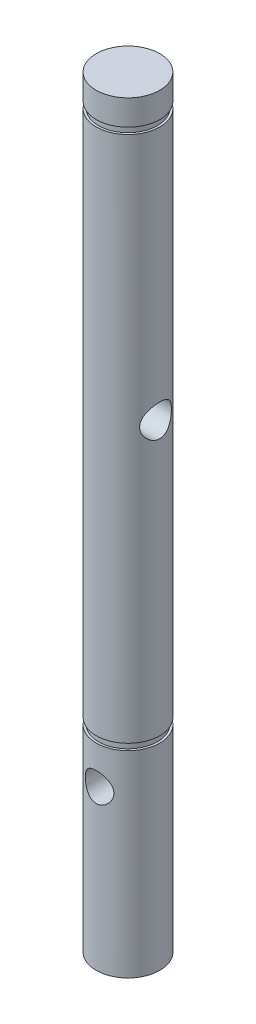
ISO-10303-21;
HEADER;
FILE_DESCRIPTION(('STEP AP214'),'2;1');
FILE_NAME('part.step','',(''),(''),'','','');
FILE_SCHEMA(('AUTOMOTIVE_DESIGN { 1 0 10303 214 1 1 1 1 }'));
ENDSEC;
DATA;
#1=APPLICATION_CONTEXT('core data for automotive mechanical design processes');
#2=APPLICATION_PROTOCOL_DEFINITION('international standard','automotive_design',2000,#1);
#3=PRODUCT_CONTEXT('',#1,'mechanical');
#4=PRODUCT('Part','Part','',(#3));
#5=PRODUCT_RELATED_PRODUCT_CATEGORY('part','',(#4));
#6=PRODUCT_DEFINITION_FORMATION('','',#4);
#7=PRODUCT_DEFINITION_CONTEXT('part definition',#1,'design');
#8=PRODUCT_DEFINITION('design','',#6,#7);
#9=PRODUCT_DEFINITION_SHAPE('','',#8);
#10=(LENGTH_UNIT() NAMED_UNIT(*) SI_UNIT(.MILLI.,.METRE.));
#11=(NAMED_UNIT(*) PLANE_ANGLE_UNIT() SI_UNIT($,.RADIAN.));
#12=(NAMED_UNIT(*) SI_UNIT($,.STERADIAN.) SOLID_ANGLE_UNIT());
#13=UNCERTAINTY_MEASURE_WITH_UNIT(LENGTH_MEASURE(1.E-05),#10,'distance_accuracy_value','');
#14=(GEOMETRIC_REPRESENTATION_CONTEXT(3) GLOBAL_UNCERTAINTY_ASSIGNED_CONTEXT((#13)) GLOBAL_UNIT_ASSIGNED_CONTEXT((#10,
#11,#12)) REPRESENTATION_CONTEXT('',''));
#15=CARTESIAN_POINT('',(0.,0.,0.));
#16=DIRECTION('',(0.,0.,1.));
#17=DIRECTION('',(1.,0.,0.));
#18=AXIS2_PLACEMENT_3D('',#15,#16,#17);
#19=CARTESIAN_POINT('',(0.,60.,0.));
#20=DIRECTION('',(0.,-1.,0.));
#21=DIRECTION('',(0.,0.,-0.999999999999999));
#22=AXIS2_PLACEMENT_3D('',#19,#20,#21);
#23=CYLINDRICAL_SURFACE('',#22,5.);
#24=CARTESIAN_POINT('',(-5.00000000000006,12.5,0.));
#25=CARTESIAN_POINT('',(-4.99999177550481,12.500009669056,-0.13142668233428));
#26=CARTESIAN_POINT('',(-4.99476199135279,12.510425561774,-0.263015634437191));
#27=CARTESIAN_POINT('',(-4.97435418561017,12.551631821162,-0.522301454622866));
#28=CARTESIAN_POINT('',(-4.95915727187672,12.582460880925,-0.64999044856409));
#29=CARTESIAN_POINT('',(-4.92040690922479,12.6629846227188,-0.897333631316197));
#30=CARTESIAN_POINT('',(-4.89688595907258,12.7126059877827,-1.01701694536277));
#31=CARTESIAN_POINT('',(-4.84364443325825,12.8289265262518,-1.24618160399671));
#32=CARTESIAN_POINT('',(-4.81392434644419,12.8956243531451,-1.35566375203769));
#33=CARTESIAN_POINT('',(-4.7489064505063,13.0487931316426,-1.56876952630997));
#34=CARTESIAN_POINT('',(-4.71337997659087,13.1362162002298,-1.67163802294308));
#35=CARTESIAN_POINT('',(-4.6414992577673,13.3263036959853,-1.86194861703333));
#36=CARTESIAN_POINT('',(-4.60514440566902,13.4289796288401,-1.94937895911556));
#37=CARTESIAN_POINT('',(-4.53247377945627,13.6562083744453,-2.11312999967248));
#38=CARTESIAN_POINT('',(-4.49637967412566,13.781840246035,-2.18806333849064));
#39=CARTESIAN_POINT('',(-4.43214946943551,14.0459183397954,-2.31542056761488));
#40=CARTESIAN_POINT('',(-4.40400769020791,14.1843553217626,-2.36786053751678));
#41=CARTESIAN_POINT('',(-4.36144667591401,14.4616627635964,-2.44533110537648));
#42=CARTESIAN_POINT('',(-4.3463067895845,14.6000111301796,-2.47181464267575));
#43=CARTESIAN_POINT('',(-4.32954724872148,14.8799470944376,-2.5010674832974));
#44=CARTESIAN_POINT('',(-4.32791423358429,15.0215313521751,-2.50386022093907));
#45=CARTESIAN_POINT('',(-4.33777325642936,15.2857150607909,-2.48671821792512));
#46=CARTESIAN_POINT('',(-4.34771909154982,15.4085600780583,-2.46946139884052));
#47=CARTESIAN_POINT('',(-4.37690571834674,15.6493047734319,-2.4173496226438));
#48=CARTESIAN_POINT('',(-4.39614947079455,15.7672028632631,-2.38248905974452));
#49=CARTESIAN_POINT('',(-4.44218691031841,15.9980728314143,-2.29552445096457));
#50=CARTESIAN_POINT('',(-4.46914601659994,16.1108659969645,-2.24303766778984));
#51=CARTESIAN_POINT('',(-4.52758510703508,16.3265857314749,-2.12260421917008));
#52=CARTESIAN_POINT('',(-4.55906711950469,16.4295078390002,-2.05465060953117));
#53=CARTESIAN_POINT('',(-4.62782894758205,16.6363031318581,-1.8951651372819));
#54=CARTESIAN_POINT('',(-4.66533775591861,16.7386421839404,-1.80173614592315));
#55=CARTESIAN_POINT('',(-4.7386905825102,16.9268385464772,-1.5988889468534));
#56=CARTESIAN_POINT('',(-4.77453379897004,17.0126879800847,-1.48946314143568));
#57=CARTESIAN_POINT('',(-4.84254968207409,17.1692141525743,-1.25129126457959));
#58=CARTESIAN_POINT('',(-4.87447460405015,17.2390011811143,-1.12188397899849));
#59=CARTESIAN_POINT('',(-4.92894702803107,17.3552425726075,-0.851165538721943));
#60=CARTESIAN_POINT('',(-4.95150197358891,17.4017154625379,-0.709863940663126));
#61=CARTESIAN_POINT('',(-4.98310834353577,17.4661885092917,-0.431916229151755));
#62=CARTESIAN_POINT('',(-4.9931234575324,17.4862280893669,-0.295853826370885));
#63=CARTESIAN_POINT('',(-5.00182533647793,17.5036618278361,-0.0219489998732789));
#64=CARTESIAN_POINT('',(-5.00051746803424,17.5010667140985,0.115892549675112));
#65=CARTESIAN_POINT('',(-4.98727980633467,17.4744832789533,0.378082429964652));
#66=CARTESIAN_POINT('',(-4.97618114219993,17.4521686681756,0.5026485201237));
#67=CARTESIAN_POINT('',(-4.9455542828753,17.3894048202616,0.746017230755967));
#68=CARTESIAN_POINT('',(-4.92602515837623,17.3489535838641,0.86481921423188));
#69=CARTESIAN_POINT('',(-4.87960628532327,17.2500038339196,1.09722152111965));
#70=CARTESIAN_POINT('',(-4.85252204417874,17.1910223747177,1.21057599249832));
#71=CARTESIAN_POINT('',(-4.79359935799751,17.0572311608751,1.4261534042644));
#72=CARTESIAN_POINT('',(-4.76175888940532,16.9824146634801,1.52837157450204));
#73=CARTESIAN_POINT('',(-4.69270553315083,16.8105989367091,1.72941922315489));
#74=CARTESIAN_POINT('',(-4.65527212009487,16.7121428290247,1.826930194285));
#75=CARTESIAN_POINT('',(-4.58155978921588,16.5001871219505,2.00464080257225));
#76=CARTESIAN_POINT('',(-4.54528168472407,16.38667720293,2.08482846428689));
#77=CARTESIAN_POINT('',(-4.47627980545279,16.1408908645153,2.22926978618998));
#78=CARTESIAN_POINT('',(-4.44381323981255,16.0079718347088,2.29256373922248));
#79=CARTESIAN_POINT('',(-4.38935180726746,15.7312248311174,2.39520706511462));
#80=CARTESIAN_POINT('',(-4.36734345549013,15.5874111839999,2.43458729077057));
#81=CARTESIAN_POINT('',(-4.33903752569351,15.307724442637,2.48465421767006));
#82=CARTESIAN_POINT('',(-4.33143458674097,15.172414365881,2.49773248744362));
#83=CARTESIAN_POINT('',(-4.32913386592581,14.9013823326192,2.50172288950903));
#84=CARTESIAN_POINT('',(-4.33443049025113,14.7656605801263,2.49264462983273));
#85=CARTESIAN_POINT('',(-4.35594655164666,14.5112912443831,2.45481530197338));
#86=CARTESIAN_POINT('',(-4.37107736338136,14.3922488182792,2.42802074302699));
#87=CARTESIAN_POINT('',(-4.40927540337603,14.1604797078,2.35793843840545));
#88=CARTESIAN_POINT('',(-4.43234518434963,14.0477550684334,2.31464538728735));
#89=CARTESIAN_POINT('',(-4.48571326433411,13.8234378472802,2.20953919315542));
#90=CARTESIAN_POINT('',(-4.51639307998451,13.7124301482649,2.14667719009406));
#91=CARTESIAN_POINT('',(-4.58088327077456,13.5018137567599,2.00537808387992));
#92=CARTESIAN_POINT('',(-4.61469526970765,13.4022110373712,1.92693287765891));
#93=CARTESIAN_POINT('',(-4.68655816327008,13.2046446362503,1.74550556946069));
#94=CARTESIAN_POINT('',(-4.7246249151498,13.1083506358286,1.64070022469214));
#95=CARTESIAN_POINT('',(-4.79694347383546,12.9343441505719,1.41539785420688));
#96=CARTESIAN_POINT('',(-4.83119321905444,12.8566416813941,1.29489242426335));
#97=CARTESIAN_POINT('',(-4.8924514945778,12.7219030205159,1.03978808878538));
#98=CARTESIAN_POINT('',(-4.91940711437488,12.6650168322155,0.905095560782314));
#99=CARTESIAN_POINT('',(-4.95177960923351,12.5978161412076,0.696328709257376));
#100=CARTESIAN_POINT('',(-4.96122314081874,12.5784446019981,0.625670413494109));
#101=CARTESIAN_POINT('',(-4.97717127275101,12.5459340516294,0.482623997839271));
#102=CARTESIAN_POINT('',(-4.9836776682316,12.5327912333236,0.41023696309241));
#103=CARTESIAN_POINT('',(-4.9923820076613,12.5152625277153,0.281518684621679));
#104=CARTESIAN_POINT('',(-4.99523288466453,12.5095450634686,0.225408499555456));
#105=CARTESIAN_POINT('',(-4.99904367329659,12.5019116705342,0.112875528456308));
#106=CARTESIAN_POINT('',(-5.00000353273202,12.4999958467745,0.0564527338382416));
#107=CARTESIAN_POINT('',(-5.00000000000006,12.5,0.));
#108=B_SPLINE_CURVE_WITH_KNOTS('',3,(#24,#25,#26,#27,#28,#29,#30,#31,#32,#33,#34,#35,#36,#37,
#38,#39,#40,#41,#42,#43,#44,#45,#46,#47,#48,#49,#50,#51,#52,#53,#54,#55,#56,#57,#58,#59,#60,#61,
#62,#63,#64,#65,#66,#67,#68,#69,#70,#71,#72,#73,#74,#75,#76,#77,#78,#79,#80,#81,#82,#83,#84,#85,
#86,#87,#88,#89,#90,#91,#92,#93,#94,#95,#96,#97,#98,#99,#100,#101,#102,#103,#104,#105,#106,
#107),.UNSPECIFIED.,.T.,.F.,(4,2,2,2,2,2,2,2,2,2,2,2,2,2,2,2,2,2,2,2,2,2,2,2,2,2,2,2,2,2,2,2,2,
2,2,2,2,2,2,2,2,4),(0.,0.394060643550742,0.788870374273022,1.18215538873078,1.57540940145396,
1.99245439679526,2.40981559413512,2.85954316076885,3.30894869745706,3.73145030350578,
4.15353393322554,4.52514281023304,4.89687009814198,5.27725600421219,5.65781303150554,
6.08662353334698,6.5156383649672,6.96457555536104,7.413155422807,7.82458226178364,
8.23581411278687,8.61517266265303,8.99457304077327,9.38482140069746,9.77523626870849,
10.2039902661037,10.6330397153795,11.0828670540369,11.53211279863,11.9382326875699,
12.3441764966107,12.7114482562151,13.0788382197025,13.4709114195009,13.8631890285845,
14.303131068923,14.7433095845248,15.1866003415819,15.407934939208,15.6291340766844,
15.7983933645035,15.9676573239323),.UNSPECIFIED.);
#109=CARTESIAN_POINT('',(-5.00000000000006,12.5,0.));
#110=VERTEX_POINT('',#109);
#111=EDGE_CURVE('E12',#110,#110,#108,.T.);
#112=ORIENTED_EDGE('',*,*,#111,.T.);
#113=EDGE_LOOP('',(#112));
#114=FACE_BOUND('',#113,.T.);
#115=CARTESIAN_POINT('',(4.33012701892221,15.,-2.49999999999992));
#116=CARTESIAN_POINT('',(4.33013982272995,14.8697334931235,-2.4999894843642));
#117=CARTESIAN_POINT('',(4.33609541965583,14.7392972793237,-2.48974954513162));
#118=CARTESIAN_POINT('',(4.35905877051905,14.4824310284707,-2.44930840724943));
#119=CARTESIAN_POINT('',(4.37608974726021,14.3560099959427,-2.41906526369544));
#120=CARTESIAN_POINT('',(4.41873376871657,14.1113710544389,-2.34024976997567));
#121=CARTESIAN_POINT('',(4.44430111338919,13.9931134264377,-2.29177485369959));
#122=CARTESIAN_POINT('',(4.50106659111457,13.7664394369054,-2.1781688405641));
#123=CARTESIAN_POINT('',(4.53226502875888,13.6580236082041,-2.11303684262669));
#124=CARTESIAN_POINT('',(4.59992173524857,13.444235696083,-1.9616663431725));
#125=CARTESIAN_POINT('',(4.63660159331581,13.3398521655102,-1.87413008816911));
#126=CARTESIAN_POINT('',(4.70929956727452,13.1464790242867,-1.68313452122743));
#127=CARTESIAN_POINT('',(4.74531734512765,13.0574970922449,-1.57966731506045));
#128=CARTESIAN_POINT('',(4.81553692452133,12.8915821235143,-1.35122390789075));
#129=CARTESIAN_POINT('',(4.84945266064072,12.8158655807208,-1.22526797235887));
#130=CARTESIAN_POINT('',(4.90876890230194,12.6871478665161,-0.960392566671062));
#131=CARTESIAN_POINT('',(4.93417477954534,12.6341323595614,-0.821481345389905));
#132=CARTESIAN_POINT('',(4.97201153115068,12.5562383468359,-0.545112359773455));
#133=CARTESIAN_POINT('',(4.98523700553424,12.5296261841348,-0.408254476210918));
#134=CARTESIAN_POINT('',(5.00018959613975,12.4995847032887,-0.131426571755628));
#135=CARTESIAN_POINT('',(5.00192366961172,12.4961413580046,0.00854151460654318));
#136=CARTESIAN_POINT('',(4.9940745479141,12.5118666849314,0.274581311061988));
#137=CARTESIAN_POINT('',(4.98546239730479,12.5290950388045,0.400802997942698));
#138=CARTESIAN_POINT('',(4.95935613149292,12.5822021097601,0.64828442979513));
#139=CARTESIAN_POINT('',(4.9418613516596,12.6180822224401,0.769543802734638));
#140=CARTESIAN_POINT('',(4.89928958219153,12.7077064152249,1.00577347892409));
#141=CARTESIAN_POINT('',(4.87411103823004,12.7616907829302,1.12063355878803));
#142=CARTESIAN_POINT('',(4.81844114966713,12.8856585405036,1.3399420037833));
#143=CARTESIAN_POINT('',(4.78794790393706,12.9556476582558,1.44438662209661));
#144=CARTESIAN_POINT('',(4.72110985998071,13.1172383788325,1.65043415224551));
#145=CARTESIAN_POINT('',(4.68448439995439,13.210257570815,1.75083518757343));
#146=CARTESIAN_POINT('',(4.61135851467031,13.4114743123254,1.93526092574447));
#147=CARTESIAN_POINT('',(4.57485820664071,13.5196834306851,2.01927302893558));
#148=CARTESIAN_POINT('',(4.5036039023121,13.7566204810602,2.17376333660552));
#149=CARTESIAN_POINT('',(4.46910799976771,13.8862150576355,2.24304328744513));
#150=CARTESIAN_POINT('',(4.40938625696441,14.1573441783974,2.35829778250312));
#151=CARTESIAN_POINT('',(4.38415075115166,14.2988660825438,2.4042966455273));
#152=CARTESIAN_POINT('',(4.34861589542584,14.5780362782069,2.46795052756267));
#153=CARTESIAN_POINT('',(4.33729139621243,14.7151027976088,2.48756280529997));
#154=CARTESIAN_POINT('',(4.32794798404026,14.9910033537913,2.50379236652859));
#155=CARTESIAN_POINT('',(4.32991967223277,15.1298360727994,2.50042589328761));
#156=CARTESIAN_POINT('',(4.3458584135146,15.3891347964467,2.47259010835997));
#157=CARTESIAN_POINT('',(4.35848968766636,15.5099486277696,2.4504695417812));
#158=CARTESIAN_POINT('',(4.39235053878354,15.7459194656774,2.38924071158115));
#159=CARTESIAN_POINT('',(4.41358290012584,15.8610746268668,2.35012694655912));
#160=CARTESIAN_POINT('',(4.4634055519914,16.0885283272563,2.25411897151221));
#161=CARTESIAN_POINT('',(4.49229108107658,16.2004475421325,2.19648515923166));
#162=CARTESIAN_POINT('',(4.55390298743127,16.4136731788488,2.06571766003972));
#163=CARTESIAN_POINT('',(4.58663133387873,16.5149741087881,1.99257601083125));
#164=CARTESIAN_POINT('',(4.65719996140835,16.7174469188033,1.82209291799637));
#165=CARTESIAN_POINT('',(4.69516457885708,16.8169928767722,1.72286318078437));
#166=CARTESIAN_POINT('',(4.76835587444748,16.9985305950059,1.50851123849885));
#167=CARTESIAN_POINT('',(4.80358162519331,17.0805164256585,1.39338368664995));
#168=CARTESIAN_POINT('',(4.86853404227335,17.2264343147908,1.14633840638515));
#169=CARTESIAN_POINT('',(4.89809104179854,17.2898327952084,1.01405774389068));
#170=CARTESIAN_POINT('',(4.94708387398472,17.392844759962,0.738805911647383));
#171=CARTESIAN_POINT('',(4.9665285919175,17.432479129605,0.595844253647114));
#172=CARTESIAN_POINT('',(4.99168770453971,17.4834214093564,0.317449205674753));
#173=CARTESIAN_POINT('',(4.99849819767838,17.4969946858303,0.182528609085428));
#174=CARTESIAN_POINT('',(5.00105325940468,17.5021081674945,-0.0878149643373655));
#175=CARTESIAN_POINT('',(4.99680170177046,17.493656085661,-0.223237748726942));
#176=CARTESIAN_POINT('',(4.97834922085641,17.4564589696044,-0.481344982671009));
#177=CARTESIAN_POINT('',(4.96482236636807,17.4290878283636,-0.604280801321727));
#178=CARTESIAN_POINT('',(4.92980234191731,17.3566825502416,-0.843614873664426));
#179=CARTESIAN_POINT('',(4.90830802955521,17.3116458803663,-0.960012187087182));
#180=CARTESIAN_POINT('',(4.85814826741492,17.2031821812606,-1.18855854199591));
#181=CARTESIAN_POINT('',(4.82921542506804,17.1390509753101,-1.30031295715362));
#182=CARTESIAN_POINT('',(4.76720333344982,16.9951058898524,-1.51193650408536));
#183=CARTESIAN_POINT('',(4.73412218229098,16.9152848073731,-1.61180014305398));
#184=CARTESIAN_POINT('',(4.66321523550919,16.7330042055506,-1.80728542324369));
#185=CARTESIAN_POINT('',(4.62524489658364,16.6290822739992,-1.90149582349001));
#186=CARTESIAN_POINT('',(4.55157698284942,16.4063847146177,-2.071656604925));
#187=CARTESIAN_POINT('',(4.51588143910585,16.2875960858007,-2.14759083151535));
#188=CARTESIAN_POINT('',(4.44998982823926,16.0333638823357,-2.28108393396024));
#189=CARTESIAN_POINT('',(4.42000320346983,15.8975126115754,-2.33798627977445));
#190=CARTESIAN_POINT('',(4.38370272660092,15.6867773504802,-2.40494911880456));
#191=CARTESIAN_POINT('',(4.37305486646054,15.6154402243024,-2.42419582683988));
#192=CARTESIAN_POINT('',(4.35507574170933,15.4709593031506,-2.45635087255785));
#193=CARTESIAN_POINT('',(4.34774215854231,15.3978168090455,-2.4692636417917));
#194=CARTESIAN_POINT('',(4.33823779542918,15.270499013453,-2.48591166201418));
#195=CARTESIAN_POINT('',(4.33520487024789,15.2165836784878,-2.491188649792));
#196=CARTESIAN_POINT('',(4.33114674911323,15.1084553836896,-2.4982351254393));
#197=CARTESIAN_POINT('',(4.33012168747262,15.0542424041894,-2.50000437866468));
#198=CARTESIAN_POINT('',(4.33012701892221,15.,-2.49999999999992));
#199=B_SPLINE_CURVE_WITH_KNOTS('',3,(#115,#116,#117,#118,#119,#120,#121,#122,#123,#124,#125,
#126,#127,#128,#129,#130,#131,#132,#133,#134,#135,#136,#137,#138,#139,#140,#141,#142,#143,#144,
#145,#146,#147,#148,#149,#150,#151,#152,#153,#154,#155,#156,#157,#158,#159,#160,#161,#162,#163,
#164,#165,#166,#167,#168,#169,#170,#171,#172,#173,#174,#175,#176,#177,#178,#179,#180,#181,#182,
#183,#184,#185,#186,#187,#188,#189,#190,#191,#192,#193,#194,#195,#196,#197,#198),.UNSPECIFIED.,
.T.,.F.,(4,2,2,2,2,2,2,2,2,2,2,2,2,2,2,2,2,2,2,2,2,2,2,2,2,2,2,2,2,2,2,2,2,2,2,2,2,2,2,2,2,4),
(0.,0.39058030648679,0.781982232061999,1.17132148982694,1.56068181366377,1.98215578129649,
2.40383927716018,2.85394730601998,3.30377067414817,3.72158712424925,4.13915059220184,
4.5204024371643,4.90168281298723,5.28823836832952,5.67493248380763,6.09817978647309,
6.52175120619879,6.97222104328703,7.42221935534343,7.83655727140608,8.2506023297601,
8.61935458565144,8.98822631095241,9.37418241020305,9.76033715555206,10.1951685895662,
10.6301466245059,11.076604535375,11.5226694952701,11.927806759788,12.3328021699001,
12.7111106218381,13.0894733378512,13.4840187680377,13.8787457525689,14.3127560463025,
14.7471485711797,15.195268726016,15.4189244153949,15.6424233996907,15.8050484542806,
15.9676843870379),.UNSPECIFIED.);
#200=CARTESIAN_POINT('',(4.33012701892221,15.,-2.49999999999992));
#201=VERTEX_POINT('',#200);
#202=EDGE_CURVE('E58',#201,#201,#199,.T.);
#203=ORIENTED_EDGE('',*,*,#202,.T.);
#204=EDGE_LOOP('',(#203));
#205=FACE_BOUND('',#204,.T.);
#206=CARTESIAN_POINT('',(0.,-28.,0.));
#207=DIRECTION('',(0.,-1.,0.));
#208=DIRECTION('',(0.,0.,-0.999999999999999));
#209=AXIS2_PLACEMENT_3D('',#206,#207,#208);
#210=CIRCLE('',#209,5.);
#211=CARTESIAN_POINT('',(0.,-28.,-4.99999999999994));
#212=VERTEX_POINT('',#211);
#213=EDGE_CURVE('E126',#212,#212,#210,.T.);
#214=ORIENTED_EDGE('',*,*,#213,.F.);
#215=EDGE_LOOP('',(#214));
#216=FACE_BOUND('',#215,.T.);
#217=CARTESIAN_POINT('',(0.,55.,0.));
#218=DIRECTION('',(0.,1.,0.));
#219=DIRECTION('',(0.,0.,0.999999999999999));
#220=AXIS2_PLACEMENT_3D('',#217,#218,#219);
#221=CIRCLE('',#220,5.);
#222=CARTESIAN_POINT('',(0.,55.,5.00000000000005));
#223=VERTEX_POINT('',#222);
#224=EDGE_CURVE('E138',#223,#223,#221,.T.);
#225=ORIENTED_EDGE('',*,*,#224,.F.);
#226=EDGE_LOOP('',(#225));
#227=FACE_BOUND('',#226,.T.);
#228=ADVANCED_FACE('F46',(#114,#205,#216,#227),#23,.T.);
#229=CARTESIAN_POINT('',(0.,-29.,0.));
#230=DIRECTION('',(0.,-1.,0.));
#231=DIRECTION('',(0.,0.,-0.999999999999999));
#232=AXIS2_PLACEMENT_3D('',#229,#230,#231);
#233=CIRCLE('',#232,5.);
#234=CARTESIAN_POINT('',(0.,-29.,-4.99999999999994));
#235=VERTEX_POINT('',#234);
#236=EDGE_CURVE('E123',#235,#235,#233,.T.);
#237=ORIENTED_EDGE('',*,*,#236,.T.);
#238=EDGE_LOOP('',(#237));
#239=FACE_BOUND('',#238,.T.);
#240=CARTESIAN_POINT('',(0.,-32.7500000000001,-4.99999999999995));
#241=CARTESIAN_POINT('',(-0.11965716387211,-32.7500058491676,-4.99999518032906));
#242=CARTESIAN_POINT('',(-0.239497209577457,-32.759601445644,-4.99565681806755));
#243=CARTESIAN_POINT('',(-0.47572081670774,-32.7975995029155,-4.9787335625156));
#244=CARTESIAN_POINT('',(-0.592095550925141,-32.8260463058645,-4.96612922657749));
#245=CARTESIAN_POINT('',(-0.817598389702702,-32.900458262527,-4.93401032574622));
#246=CARTESIAN_POINT('',(-0.926750955125919,-32.9463603098896,-4.91452067131287));
#247=CARTESIAN_POINT('',(-1.13568251878514,-33.0540936958491,-4.87048664392253));
#248=CARTESIAN_POINT('',(-1.23546350613323,-33.1159216437089,-4.84594334714471));
#249=CARTESIAN_POINT('',(-1.42864166958961,-33.2574297497628,-4.79265454885507));
#250=CARTESIAN_POINT('',(-1.52144083505236,-33.3378684744534,-4.76375726911881));
#251=CARTESIAN_POINT('',(-1.69276142751267,-33.5127023979595,-4.70560933245041));
#252=CARTESIAN_POINT('',(-1.77127412914541,-33.6071060623944,-4.67635847112176));
#253=CARTESIAN_POINT('',(-1.91644184676255,-33.8139787945946,-4.61884309478032));
#254=CARTESIAN_POINT('',(-1.98211224629653,-33.9271889049173,-4.5907410607813));
#255=CARTESIAN_POINT('',(-2.09321326547299,-34.1644814582807,-4.54116574662781));
#256=CARTESIAN_POINT('',(-2.1386559792934,-34.2885573513889,-4.51968850785879));
#257=CARTESIAN_POINT('',(-2.2054422070107,-34.5371932181381,-4.48746493874355));
#258=CARTESIAN_POINT('',(-2.22794402601262,-34.6613728247451,-4.47620638732552));
#259=CARTESIAN_POINT('',(-2.25180742161624,-34.9122154005629,-4.4642537205082));
#260=CARTESIAN_POINT('',(-2.25318367120295,-35.0388765849387,-4.46355227256898));
#261=CARTESIAN_POINT('',(-2.23561914182214,-35.2785819418095,-4.47236713385346));
#262=CARTESIAN_POINT('',(-2.21854075752921,-35.3918044567285,-4.48094689435855));
#263=CARTESIAN_POINT('',(-2.16771485945774,-35.6135619764439,-4.50575226017843));
#264=CARTESIAN_POINT('',(-2.13396347414751,-35.7220958861609,-4.52197964125837));
#265=CARTESIAN_POINT('',(-2.05008139659866,-35.934338665384,-4.56062840437278));
#266=CARTESIAN_POINT('',(-1.99959732959399,-36.0378827649966,-4.58318164475392));
#267=CARTESIAN_POINT('',(-1.88393825005056,-36.2354740947609,-4.63192287969261));
#268=CARTESIAN_POINT('',(-1.8187569861469,-36.3295172590265,-4.65811241910159));
#269=CARTESIAN_POINT('',(-1.66791131474518,-36.5153506742745,-4.71435794303024));
#270=CARTESIAN_POINT('',(-1.58084940988694,-36.605972381396,-4.74453849261974));
#271=CARTESIAN_POINT('',(-1.39252160551632,-36.7717583371506,-4.80318714257215));
#272=CARTESIAN_POINT('',(-1.29125121399167,-36.846917678752,-4.83165469728903));
#273=CARTESIAN_POINT('',(-1.07332333935312,-36.9817637753532,-4.88476427737965));
#274=CARTESIAN_POINT('',(-0.956286364396289,-37.0408990655796,-4.90926046885459));
#275=CARTESIAN_POINT('',(-0.712539817711637,-37.1382179714549,-4.95050723789678));
#276=CARTESIAN_POINT('',(-0.585836558945014,-37.1764151304037,-4.96726282117478));
#277=CARTESIAN_POINT('',(-0.336050927795551,-37.2281520066184,-4.99015693100552));
#278=CARTESIAN_POINT('',(-0.213354125401076,-37.2432551103228,-4.99696705652225));
#279=CARTESIAN_POINT('',(0.0330028549595938,-37.2531293737671,-5.00140648285724));
#280=CARTESIAN_POINT('',(0.156662679358139,-37.2479076740922,-4.99903900798527));
#281=CARTESIAN_POINT('',(0.393606397102664,-37.2183274717246,-4.98581223187082));
#282=CARTESIAN_POINT('',(0.507068143127022,-37.1951338783838,-4.97547003197279));
#283=CARTESIAN_POINT('',(0.728326171242942,-37.1319668703197,-4.94792660884618));
#284=CARTESIAN_POINT('',(0.836121769198267,-37.091991434553,-4.93072455949594));
#285=CARTESIAN_POINT('',(1.04680328444828,-36.9951354538398,-4.89040595603712));
#286=CARTESIAN_POINT('',(1.14943204917316,-36.9377675757586,-4.86712201520418));
#287=CARTESIAN_POINT('',(1.34397554623914,-36.8082861577866,-4.81703610915166));
#288=CARTESIAN_POINT('',(1.43588556437496,-36.7361661678935,-4.79023260693114));
#289=CARTESIAN_POINT('',(1.61437331335907,-36.572309666659,-4.733210880664));
#290=CARTESIAN_POINT('',(1.69988735602748,-36.4794463329559,-4.70289328565371));
#291=CARTESIAN_POINT('',(1.85448776672916,-36.2803394360987,-4.6441071699206));
#292=CARTESIAN_POINT('',(1.92356783385006,-36.1740907647074,-4.61563936145101));
#293=CARTESIAN_POINT('',(2.04486877235093,-35.9475880061162,-4.56322301354684));
#294=CARTESIAN_POINT('',(2.0966129511578,-35.8270450849665,-4.53940877273741));
#295=CARTESIAN_POINT('',(2.17856642952349,-35.5775336202713,-4.50065987671184));
#296=CARTESIAN_POINT('',(2.20879749107805,-35.4485737356845,-4.48571625080522));
#297=CARTESIAN_POINT('',(2.24454528993169,-35.197852587887,-4.46792778615272));
#298=CARTESIAN_POINT('',(2.25196758692373,-35.0764288896237,-4.46415115998425));
#299=CARTESIAN_POINT('',(2.24714266058782,-34.8340893513423,-4.46658268326976));
#300=CARTESIAN_POINT('',(2.23489992569109,-34.7131734017487,-4.47278855427623));
#301=CARTESIAN_POINT('',(2.19277345398226,-34.4832321778432,-4.4935771634473));
#302=CARTESIAN_POINT('',(2.1640532846186,-34.3739383369966,-4.50760581250423));
#303=CARTESIAN_POINT('',(2.09103437001123,-34.1617430309526,-4.54193721731509));
#304=CARTESIAN_POINT('',(2.04673109152546,-34.0588434361493,-4.56224179857563));
#305=CARTESIAN_POINT('',(1.94052895513638,-33.8550574180614,-4.60845986490242));
#306=CARTESIAN_POINT('',(1.87767694712306,-33.754732218332,-4.63465129287792));
#307=CARTESIAN_POINT('',(1.73738062749266,-33.5654620533057,-4.68904747578364));
#308=CARTESIAN_POINT('',(1.65993003008866,-33.4765220179779,-4.71725309471249));
#309=CARTESIAN_POINT('',(1.48434630972131,-33.3042173772376,-4.77556462695211));
#310=CARTESIAN_POINT('',(1.38497509655275,-33.2220879438201,-4.80561118709983));
#311=CARTESIAN_POINT('',(1.17282336441814,-33.0755253901348,-4.86173938218817));
#312=CARTESIAN_POINT('',(1.06003671208437,-33.0111004090199,-4.88781919106815));
#313=CARTESIAN_POINT('',(0.825071548433908,-32.9027805956952,-4.93289199970097));
#314=CARTESIAN_POINT('',(0.702997935707179,-32.8586873980498,-4.9519530911614));
#315=CARTESIAN_POINT('',(0.45228184229831,-32.792136919658,-4.98108920431684));
#316=CARTESIAN_POINT('',(0.32366054497866,-32.7696140223648,-4.99119147164169));
#317=CARTESIAN_POINT('',(0.16183542120502,-32.755592142122,-4.99748612119017));
#318=CARTESIAN_POINT('',(0.129515019999608,-32.7534971190403,-4.99842714593429));
#319=CARTESIAN_POINT('',(0.0648008846979128,-32.7507002463714,-4.99968474227596));
#320=CARTESIAN_POINT('',(0.0324071496041022,-32.7499984158505,-5.00000130532752));
#321=CARTESIAN_POINT('',(0.,-32.7500000000001,-4.99999999999995));
#322=B_SPLINE_CURVE_WITH_KNOTS('',3,(#240,#241,#242,#243,#244,#245,#246,#247,#248,#249,#250,
#251,#252,#253,#254,#255,#256,#257,#258,#259,#260,#261,#262,#263,#264,#265,#266,#267,#268,#269,
#270,#271,#272,#273,#274,#275,#276,#277,#278,#279,#280,#281,#282,#283,#284,#285,#286,#287,#288,
#289,#290,#291,#292,#293,#294,#295,#296,#297,#298,#299,#300,#301,#302,#303,#304,#305,#306,#307,
#308,#309,#310,#311,#312,#313,#314,#315,#316,#317,#318,#319,#320,#321),.UNSPECIFIED.,.T.,.F.,(4,
2,2,2,2,2,2,2,2,2,2,2,2,2,2,2,2,2,2,2,2,2,2,2,2,2,2,2,2,2,2,2,2,2,2,2,2,2,2,2,4),(0.,
0.358838474045349,0.718524024886252,1.07692137234711,1.43524247745082,1.81211589040076,
2.18921870938881,2.58877923399084,2.98810053852171,3.36607753259056,3.74379198689981,
4.08666490416545,4.42961747522451,4.78033096378949,5.13119390858606,5.51719011281453,
5.90330862586184,6.30138888099419,6.69921134324778,7.06867955514887,7.43801797582665,
7.7852352801115,8.13249441190384,8.49055929702826,8.84878107324677,9.23652488450205,
9.62441712097645,10.0222360675985,10.4196520187761,10.7828144841469,11.1458940715369,
11.486031651511,11.8262682619787,12.1885231613985,12.5509343964945,12.9461798591982,
13.3416067227121,13.7330894595624,14.1233774929091,14.2205615861382,14.3177470093574),.UNSPECIFIED.);
#323=CARTESIAN_POINT('',(0.,-32.7500000000001,-4.99999999999995));
#324=VERTEX_POINT('',#323);
#325=EDGE_CURVE('E62',#324,#324,#322,.T.);
#326=ORIENTED_EDGE('',*,*,#325,.T.);
#327=EDGE_LOOP('',(#326));
#328=FACE_BOUND('',#327,.T.);
#329=CARTESIAN_POINT('',(2.25000000000003,-35.,4.46514277487292));
#330=CARTESIAN_POINT('',(2.2499930403159,-35.1189612127309,4.46515039872733));
#331=CARTESIAN_POINT('',(2.24050444334665,-35.2381147802611,4.46996667268981));
#332=CARTESIAN_POINT('',(2.20296952025721,-35.4728981715027,4.48857891323603));
#333=CARTESIAN_POINT('',(2.17487687589001,-35.5885184448773,4.50239729083494));
#334=CARTESIAN_POINT('',(2.10149811494298,-35.8124159714559,4.53710585458761));
#335=CARTESIAN_POINT('',(2.05629003690715,-35.9207239627151,4.55796389692784));
#336=CARTESIAN_POINT('',(1.95019826041787,-36.1281907549821,4.60435303457616));
#337=CARTESIAN_POINT('',(1.88931647308661,-36.2273506694296,4.62988356005074));
#338=CARTESIAN_POINT('',(1.74886682448112,-36.4209847689928,4.68481687387392));
#339=CARTESIAN_POINT('',(1.66832919766814,-36.5147149367887,4.71436409953239));
#340=CARTESIAN_POINT('',(1.49288314705885,-36.687899076354,4.7728239195421));
#341=CARTESIAN_POINT('',(1.3979686496769,-36.7673469833384,4.80173623973549));
#342=CARTESIAN_POINT('',(1.19040340238114,-36.9137357994463,4.85747480215186));
#343=CARTESIAN_POINT('',(1.07708634932842,-36.9798097543149,4.88411395697381));
#344=CARTESIAN_POINT('',(0.839526009772644,-37.0916269809751,4.93049745168424));
#345=CARTESIAN_POINT('',(0.715288381409402,-37.1373807075165,4.95024533600561));
#346=CARTESIAN_POINT('',(0.467253632116486,-37.2044687281946,4.97959116820764));
#347=CARTESIAN_POINT('',(0.343870281116729,-37.2270941945019,4.98972320525307));
#348=CARTESIAN_POINT('',(0.0946715176300251,-37.2514860613446,5.00065622282597));
#349=CARTESIAN_POINT('',(-0.031142702727161,-37.2532624388919,5.00146166644931));
#350=CARTESIAN_POINT('',(-0.272124930597757,-37.2365153850403,4.99394241822251));
#351=CARTESIAN_POINT('',(-0.387416232492528,-37.2194197052671,4.9862598459975));
#352=CARTESIAN_POINT('',(-0.613288459239035,-37.1679018148151,4.96354367577189));
#353=CARTESIAN_POINT('',(-0.7238690343381,-37.1334783200384,4.94850953297703));
#354=CARTESIAN_POINT('',(-0.939228995401003,-37.0479219494242,4.91222614034772));
#355=CARTESIAN_POINT('',(-1.04389475376014,-36.9965432134654,4.89088595660154));
#356=CARTESIAN_POINT('',(-1.24339321925697,-36.8788037048719,4.84401587857551));
#357=CARTESIAN_POINT('',(-1.33822231250922,-36.8124374542342,4.81848445331248));
#358=CARTESIAN_POINT('',(-1.52345175293303,-36.6604441642796,4.76331481407979));
#359=CARTESIAN_POINT('',(-1.61288673432275,-36.57369917665,4.73351145466942));
#360=CARTESIAN_POINT('',(-1.77639992608747,-36.3864926994671,4.67460929075163));
#361=CARTESIAN_POINT('',(-1.85047011655517,-36.2860240917899,4.64551086115736));
#362=CARTESIAN_POINT('',(-1.98423981017751,-36.0687643244717,4.59001891824134));
#363=CARTESIAN_POINT('',(-2.04317215242969,-35.9514525629961,4.56379860249306));
#364=CARTESIAN_POINT('',(-2.14003834281187,-35.7070859529058,4.51919374197601));
#365=CARTESIAN_POINT('',(-2.17799005773749,-35.580039499531,4.50080253313334));
#366=CARTESIAN_POINT('',(-2.22914248632382,-35.3295062611783,4.47567706017383));
#367=CARTESIAN_POINT('',(-2.24392437246758,-35.2064186193687,4.46820077828811));
#368=CARTESIAN_POINT('',(-2.25302242470035,-34.9593206899302,4.46362263539949));
#369=CARTESIAN_POINT('',(-2.24734789422977,-34.835310847314,4.46651605832123));
#370=CARTESIAN_POINT('',(-2.21714216163565,-34.6003998351237,4.48157509018503));
#371=CARTESIAN_POINT('',(-2.1941574385562,-34.4892441902212,4.49297960430391));
#372=CARTESIAN_POINT('',(-2.13212542419365,-34.2725003454044,4.5227442490331));
#373=CARTESIAN_POINT('',(-2.09307393216704,-34.1669136096628,4.54110619860318));
#374=CARTESIAN_POINT('',(-1.99809284583424,-33.9589518292208,4.58371481317653));
#375=CARTESIAN_POINT('',(-1.941481229876,-33.8569366350541,4.60818960972135));
#376=CARTESIAN_POINT('',(-1.81362927889094,-33.6633163861791,4.65998955680985));
#377=CARTESIAN_POINT('',(-1.7423819666651,-33.5717163291004,4.68731606376633));
#378=CARTESIAN_POINT('',(-1.57908877421525,-33.3921744620641,4.74496334454863));
#379=CARTESIAN_POINT('',(-1.48568977503587,-33.305468104843,4.77531541652942));
#380=CARTESIAN_POINT('',(-1.2850299743672,-33.148673456089,4.83317624810734));
#381=CARTESIAN_POINT('',(-1.17776699723158,-33.0785877777098,4.86068456021689));
#382=CARTESIAN_POINT('',(-0.950682209086017,-32.9566038585041,4.9101754289708));
#383=CARTESIAN_POINT('',(-0.830745952505872,-32.9048937176252,4.93210022008008));
#384=CARTESIAN_POINT('',(-0.582619539391221,-32.8228237511215,4.96751583574379));
#385=CARTESIAN_POINT('',(-0.454435271872218,-32.7924488729429,4.98101260572731));
#386=CARTESIAN_POINT('',(-0.204394813787141,-32.7560289584297,4.99726613498171));
#387=CARTESIAN_POINT('',(-0.0828396086643805,-32.7482501650669,5.00078768109052));
#388=CARTESIAN_POINT('',(0.159848279708557,-32.7524088088586,4.99891579804314));
#389=CARTESIAN_POINT('',(0.28098105437542,-32.7643416758091,4.99352443536979));
#390=CARTESIAN_POINT('',(0.51354948845284,-32.8063523683349,4.97486307031118));
#391=CARTESIAN_POINT('',(0.625174452755526,-32.8355644965561,4.96196940870595));
#392=CARTESIAN_POINT('',(0.841845251095427,-32.910278337663,4.92983796875458));
#393=CARTESIAN_POINT('',(0.946889948144501,-32.9557828565987,4.91059909761353));
#394=CARTESIAN_POINT('',(1.15275170653519,-33.0640748909494,4.86649288960119));
#395=CARTESIAN_POINT('',(1.2531547875782,-33.1275585236712,4.84140812281748));
#396=CARTESIAN_POINT('',(1.44232456339336,-33.2690554185828,4.78846161065108));
#397=CARTESIAN_POINT('',(1.5310862131628,-33.3470749449179,4.76059867044872));
#398=CARTESIAN_POINT('',(1.70196716671102,-33.522836352474,4.70235094807992));
#399=CARTESIAN_POINT('',(1.78296764783155,-33.6216633278591,4.67194455656391));
#400=CARTESIAN_POINT('',(1.92749297632143,-33.8322647993636,4.6142000672583));
#401=CARTESIAN_POINT('',(1.9910065891598,-33.9440475537768,4.5868639486267));
#402=CARTESIAN_POINT('',(2.09879543180339,-34.1788484638152,4.53856864513174));
#403=CARTESIAN_POINT('',(2.14295192965232,-34.3019305094901,4.51764904631094));
#404=CARTESIAN_POINT('',(2.19275164773714,-34.4914549837553,4.4935689889467));
#405=CARTESIAN_POINT('',(2.20660710269014,-34.5553848902609,4.48676181351283));
#406=CARTESIAN_POINT('',(2.22871677888323,-34.6844163971542,4.47582163437341));
#407=CARTESIAN_POINT('',(2.23697517989224,-34.7495170858459,4.4716866352471));
#408=CARTESIAN_POINT('',(2.24491269447912,-34.8456576646017,4.46770340658956));
#409=CARTESIAN_POINT('',(2.24681915664304,-34.87648591137,4.4667446489617));
#410=CARTESIAN_POINT('',(2.24936373361879,-34.9382051103307,4.46546333269435));
#411=CARTESIAN_POINT('',(2.25000180799799,-34.9690960644907,4.46514079433574));
#412=CARTESIAN_POINT('',(2.25000000000003,-35.,4.46514277487292));
#413=B_SPLINE_CURVE_WITH_KNOTS('',3,(#329,#330,#331,#332,#333,#334,#335,#336,#337,#338,#339,
#340,#341,#342,#343,#344,#345,#346,#347,#348,#349,#350,#351,#352,#353,#354,#355,#356,#357,#358,
#359,#360,#361,#362,#363,#364,#365,#366,#367,#368,#369,#370,#371,#372,#373,#374,#375,#376,#377,
#378,#379,#380,#381,#382,#383,#384,#385,#386,#387,#388,#389,#390,#391,#392,#393,#394,#395,#396,
#397,#398,#399,#400,#401,#402,#403,#404,#405,#406,#407,#408,#409,#410,#411,#412),.UNSPECIFIED.,
.T.,.F.,(4,2,2,2,2,2,2,2,2,2,2,2,2,2,2,2,2,2,2,2,2,2,2,2,2,2,2,2,2,2,2,2,2,2,2,2,2,2,2,2,2,4),
(0.,0.35675974298756,0.714411062073177,1.07045091984828,1.42644738561856,1.80599601944601,
2.18570544513355,2.58519198578236,2.98447275197117,3.35999219707466,3.73533193577189,
4.08410830185015,4.43291051821013,4.7870107588926,5.14124063485557,5.52388400014618,
5.90672659268637,6.30625734447516,6.70544733553705,7.07598167335183,7.4463475159109,
7.78705357899951,8.12784877819477,8.4840202297551,8.84036187276865,9.23157909435332,
9.62285778358311,10.0180336177098,10.412930364732,10.7766046049826,11.1401945381678,
11.4869501554105,11.83376552337,12.1964652511595,12.5593216450042,12.9515422543471,
13.3440142630044,13.7388610212111,13.9359176589376,14.1328269760451,14.2255036426529,
14.318183263485),.UNSPECIFIED.);
#414=CARTESIAN_POINT('',(2.25000000000003,-35.,4.46514277487292));
#415=VERTEX_POINT('',#414);
#416=EDGE_CURVE('E66',#415,#415,#413,.T.);
#417=ORIENTED_EDGE('',*,*,#416,.T.);
#418=EDGE_LOOP('',(#417));
#419=FACE_BOUND('',#418,.T.);
#420=CARTESIAN_POINT('',(0.,-60.,0.));
#421=DIRECTION('',(0.,1.,0.));
#422=DIRECTION('',(0.,0.,0.999999999999999));
#423=AXIS2_PLACEMENT_3D('',#420,#421,#422);
#424=CIRCLE('',#423,5.);
#425=CARTESIAN_POINT('',(0.,-60.,5.));
#426=VERTEX_POINT('',#425);
#427=EDGE_CURVE('E120',#426,#426,#424,.T.);
#428=ORIENTED_EDGE('',*,*,#427,.T.);
#429=EDGE_LOOP('',(#428));
#430=FACE_BOUND('',#429,.T.);
#431=ADVANCED_FACE('F48',(#239,#328,#419,#430),#23,.T.);
#432=CARTESIAN_POINT('',(0.,-60.,0.));
#433=DIRECTION('',(0.,1.,0.));
#434=DIRECTION('',(0.,0.,0.999999999999999));
#435=AXIS2_PLACEMENT_3D('',#432,#433,#434);
#436=PLANE('',#435);
#437=ORIENTED_EDGE('',*,*,#427,.F.);
#438=EDGE_LOOP('',(#437));
#439=FACE_BOUND('',#438,.T.);
#440=ADVANCED_FACE('F111',(#439),#436,.F.);
#441=CARTESIAN_POINT('',(0.,-35.,-4.99999999999995));
#442=DIRECTION('',(0.,0.,0.999999999999999));
#443=DIRECTION('',(1.,0.,0.));
#444=AXIS2_PLACEMENT_3D('',#441,#442,#443);
#445=CYLINDRICAL_SURFACE('',#444,2.25);
#446=ORIENTED_EDGE('',*,*,#416,.F.);
#447=EDGE_LOOP('',(#446));
#448=FACE_BOUND('',#447,.T.);
#449=ORIENTED_EDGE('',*,*,#325,.F.);
#450=EDGE_LOOP('',(#449));
#451=FACE_BOUND('',#450,.T.);
#452=ADVANCED_FACE('F104',(#448,#451),#445,.F.);
#453=CARTESIAN_POINT('',(0.,-29.,0.));
#454=DIRECTION('',(0.,-1.,0.));
#455=DIRECTION('',(0.,0.,-0.999999999999999));
#456=AXIS2_PLACEMENT_3D('',#453,#454,#455);
#457=PLANE('',#456);
#458=ORIENTED_EDGE('',*,*,#236,.F.);
#459=EDGE_LOOP('',(#458));
#460=FACE_BOUND('',#459,.T.);
#461=CARTESIAN_POINT('',(0.,-29.,0.));
#462=DIRECTION('',(0.,-1.,0.));
#463=DIRECTION('',(0.,0.,-0.999999999999999));
#464=AXIS2_PLACEMENT_3D('',#461,#462,#463);
#465=CIRCLE('',#464,4.65);
#466=CARTESIAN_POINT('',(0.,-29.,-4.64999999999994));
#467=VERTEX_POINT('',#466);
#468=EDGE_CURVE('E129',#467,#467,#465,.T.);
#469=ORIENTED_EDGE('',*,*,#468,.T.);
#470=EDGE_LOOP('',(#469));
#471=FACE_BOUND('',#470,.T.);
#472=ADVANCED_FACE('F101',(#460,#471),#457,.F.);
#473=CARTESIAN_POINT('',(0.,-28.,0.));
#474=DIRECTION('',(0.,-1.,0.));
#475=DIRECTION('',(0.,0.,-0.999999999999999));
#476=AXIS2_PLACEMENT_3D('',#473,#474,#475);
#477=PLANE('',#476);
#478=ORIENTED_EDGE('',*,*,#213,.T.);
#479=EDGE_LOOP('',(#478));
#480=FACE_BOUND('',#479,.T.);
#481=CARTESIAN_POINT('',(0.,-28.,0.));
#482=DIRECTION('',(0.,-1.,0.));
#483=DIRECTION('',(0.,0.,-0.999999999999999));
#484=AXIS2_PLACEMENT_3D('',#481,#482,#483);
#485=CIRCLE('',#484,4.65);
#486=CARTESIAN_POINT('',(0.,-28.,-4.64999999999994));
#487=VERTEX_POINT('',#486);
#488=EDGE_CURVE('E132',#487,#487,#485,.T.);
#489=ORIENTED_EDGE('',*,*,#488,.F.);
#490=EDGE_LOOP('',(#489));
#491=FACE_BOUND('',#490,.T.);
#492=ADVANCED_FACE('F99',(#480,#491),#477,.T.);
#493=CARTESIAN_POINT('',(0.,-29.,0.));
#494=DIRECTION('',(0.,1.,0.));
#495=DIRECTION('',(0.,0.,0.999999999999999));
#496=AXIS2_PLACEMENT_3D('',#493,#494,#495);
#497=CYLINDRICAL_SURFACE('',#496,4.65);
#498=ORIENTED_EDGE('',*,*,#468,.F.);
#499=EDGE_LOOP('',(#498));
#500=FACE_BOUND('',#499,.T.);
#501=ORIENTED_EDGE('',*,*,#488,.T.);
#502=EDGE_LOOP('',(#501));
#503=FACE_BOUND('',#502,.T.);
#504=ADVANCED_FACE('F92',(#500,#503),#497,.T.);
#505=CARTESIAN_POINT('',(0.,56.,0.));
#506=DIRECTION('',(0.,1.,0.));
#507=DIRECTION('',(0.,0.,0.999999999999999));
#508=AXIS2_PLACEMENT_3D('',#505,#506,#507);
#509=PLANE('',#508);
#510=CARTESIAN_POINT('',(0.,56.,0.));
#511=DIRECTION('',(0.,1.,0.));
#512=DIRECTION('',(0.,0.,0.999999999999999));
#513=AXIS2_PLACEMENT_3D('',#510,#511,#512);
#514=CIRCLE('',#513,5.);
#515=CARTESIAN_POINT('',(0.,56.,5.00000000000005));
#516=VERTEX_POINT('',#515);
#517=EDGE_CURVE('E135',#516,#516,#514,.T.);
#518=ORIENTED_EDGE('',*,*,#517,.F.);
#519=EDGE_LOOP('',(#518));
#520=FACE_BOUND('',#519,.T.);
#521=CARTESIAN_POINT('',(0.,56.,0.));
#522=DIRECTION('',(0.,1.,0.));
#523=DIRECTION('',(0.,0.,0.999999999999999));
#524=AXIS2_PLACEMENT_3D('',#521,#522,#523);
#525=CIRCLE('',#524,4.65);
#526=CARTESIAN_POINT('',(0.,56.,4.65000000000005));
#527=VERTEX_POINT('',#526);
#528=EDGE_CURVE('E141',#527,#527,#525,.T.);
#529=ORIENTED_EDGE('',*,*,#528,.T.);
#530=EDGE_LOOP('',(#529));
#531=FACE_BOUND('',#530,.T.);
#532=ADVANCED_FACE('F89',(#520,#531),#509,.F.);
#533=CARTESIAN_POINT('',(0.,55.,0.));
#534=DIRECTION('',(0.,1.,0.));
#535=DIRECTION('',(0.,0.,0.999999999999999));
#536=AXIS2_PLACEMENT_3D('',#533,#534,#535);
#537=PLANE('',#536);
#538=ORIENTED_EDGE('',*,*,#224,.T.);
#539=EDGE_LOOP('',(#538));
#540=FACE_BOUND('',#539,.T.);
#541=CARTESIAN_POINT('',(0.,55.,0.));
#542=DIRECTION('',(0.,1.,0.));
#543=DIRECTION('',(0.,0.,0.999999999999999));
#544=AXIS2_PLACEMENT_3D('',#541,#542,#543);
#545=CIRCLE('',#544,4.65);
#546=CARTESIAN_POINT('',(0.,55.,4.65000000000005));
#547=VERTEX_POINT('',#546);
#548=EDGE_CURVE('E144',#547,#547,#545,.T.);
#549=ORIENTED_EDGE('',*,*,#548,.F.);
#550=EDGE_LOOP('',(#549));
#551=FACE_BOUND('',#550,.T.);
#552=ADVANCED_FACE('F87',(#540,#551),#537,.T.);
#553=CARTESIAN_POINT('',(0.,56.,0.));
#554=DIRECTION('',(0.,-1.,0.));
#555=DIRECTION('',(0.,0.,-0.999999999999999));
#556=AXIS2_PLACEMENT_3D('',#553,#554,#555);
#557=CYLINDRICAL_SURFACE('',#556,4.65);
#558=ORIENTED_EDGE('',*,*,#528,.F.);
#559=EDGE_LOOP('',(#558));
#560=FACE_BOUND('',#559,.T.);
#561=ORIENTED_EDGE('',*,*,#548,.T.);
#562=EDGE_LOOP('',(#561));
#563=FACE_BOUND('',#562,.T.);
#564=ADVANCED_FACE('F82',(#560,#563),#557,.T.);
#565=CARTESIAN_POINT('',(0.,60.,0.));
#566=DIRECTION('',(0.,1.,0.));
#567=DIRECTION('',(0.,0.,0.999999999999999));
#568=AXIS2_PLACEMENT_3D('',#565,#566,#567);
#569=PLANE('',#568);
#570=CARTESIAN_POINT('',(0.,60.,0.));
#571=DIRECTION('',(0.,1.,0.));
#572=DIRECTION('',(0.,0.,0.999999999999999));
#573=AXIS2_PLACEMENT_3D('',#570,#571,#572);
#574=CIRCLE('',#573,5.);
#575=CARTESIAN_POINT('',(0.,60.,5.00000000000005));
#576=VERTEX_POINT('',#575);
#577=EDGE_CURVE('E119',#576,#576,#574,.T.);
#578=ORIENTED_EDGE('',*,*,#577,.T.);
#579=EDGE_LOOP('',(#578));
#580=FACE_BOUND('',#579,.T.);
#581=ADVANCED_FACE('F86',(#580),#569,.T.);
#582=ORIENTED_EDGE('',*,*,#517,.T.);
#583=EDGE_LOOP('',(#582));
#584=FACE_BOUND('',#583,.T.);
#585=ORIENTED_EDGE('',*,*,#577,.F.);
#586=EDGE_LOOP('',(#585));
#587=FACE_BOUND('',#586,.T.);
#588=ADVANCED_FACE('F80',(#584,#587),#23,.T.);
#589=CARTESIAN_POINT('',(-5.00000000000006,15.,0.));
#590=DIRECTION('',(1.,0.,0.));
#591=DIRECTION('',(0.,0.,-0.999999999999999));
#592=AXIS2_PLACEMENT_3D('',#589,#590,#591);
#593=CYLINDRICAL_SURFACE('',#592,2.5);
#594=ORIENTED_EDGE('',*,*,#202,.F.);
#595=EDGE_LOOP('',(#594));
#596=FACE_BOUND('',#595,.T.);
#597=ORIENTED_EDGE('',*,*,#111,.F.);
#598=EDGE_LOOP('',(#597));
#599=FACE_BOUND('',#598,.T.);
#600=ADVANCED_FACE('F76',(#596,#599),#593,.F.);
#601=CLOSED_SHELL('',(#228,#431,#440,#452,#472,#492,#504,#532,#552,#564,#581,#588,#600));
#602=MANIFOLD_SOLID_BREP('B2',#601);
#603=ADVANCED_BREP_SHAPE_REPRESENTATION('',(#18,#602),#14);
#604=SHAPE_DEFINITION_REPRESENTATION(#9,#603);
ENDSEC;
END-ISO-10303-21;
